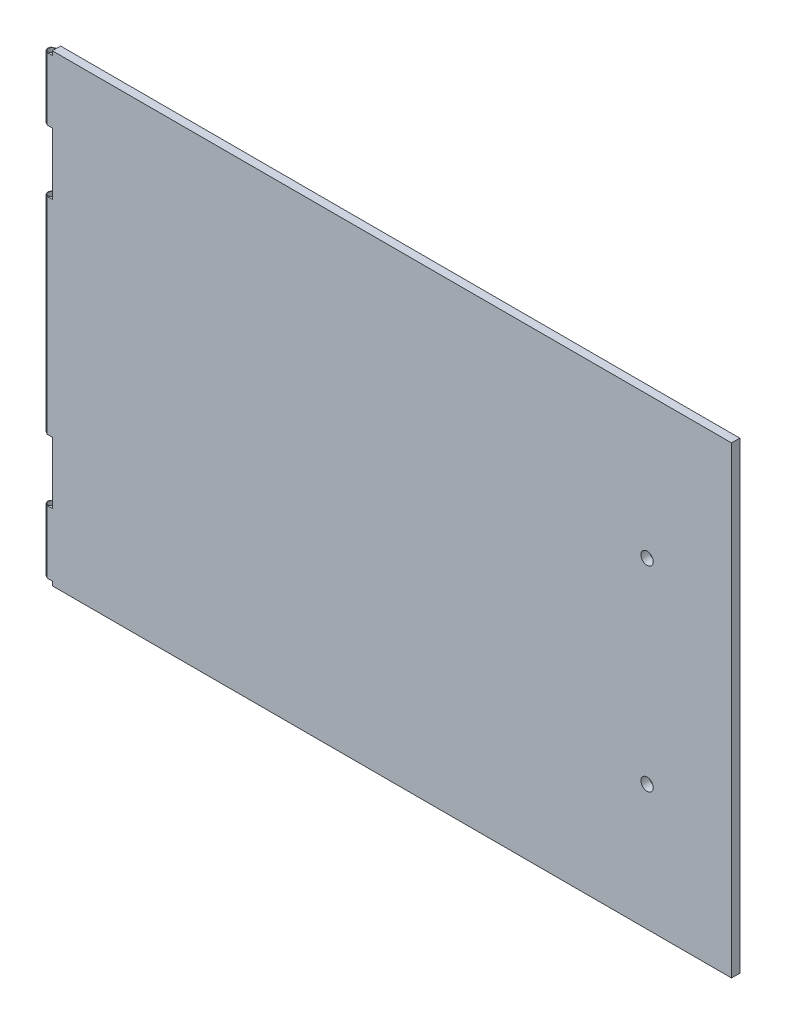
ISO-10303-21;
HEADER;
FILE_DESCRIPTION(('STEP AP214'),'2;1');
FILE_NAME('part.step','',(''),(''),'','','');
FILE_SCHEMA(('AUTOMOTIVE_DESIGN { 1 0 10303 214 1 1 1 1 }'));
ENDSEC;
DATA;
#1=APPLICATION_CONTEXT('core data for automotive mechanical design processes');
#2=APPLICATION_PROTOCOL_DEFINITION('international standard','automotive_design',2000,#1);
#3=PRODUCT_CONTEXT('',#1,'mechanical');
#4=PRODUCT('Part','Part','',(#3));
#5=PRODUCT_RELATED_PRODUCT_CATEGORY('part','',(#4));
#6=PRODUCT_DEFINITION_FORMATION('','',#4);
#7=PRODUCT_DEFINITION_CONTEXT('part definition',#1,'design');
#8=PRODUCT_DEFINITION('design','',#6,#7);
#9=PRODUCT_DEFINITION_SHAPE('','',#8);
#10=(LENGTH_UNIT() NAMED_UNIT(*) SI_UNIT(.MILLI.,.METRE.));
#11=(NAMED_UNIT(*) PLANE_ANGLE_UNIT() SI_UNIT($,.RADIAN.));
#12=(NAMED_UNIT(*) SI_UNIT($,.STERADIAN.) SOLID_ANGLE_UNIT());
#13=UNCERTAINTY_MEASURE_WITH_UNIT(LENGTH_MEASURE(1.E-05),#10,'distance_accuracy_value','');
#14=(GEOMETRIC_REPRESENTATION_CONTEXT(3) GLOBAL_UNCERTAINTY_ASSIGNED_CONTEXT((#13)) GLOBAL_UNIT_ASSIGNED_CONTEXT((#10,
#11,#12)) REPRESENTATION_CONTEXT('',''));
#15=CARTESIAN_POINT('',(0.,0.,0.));
#16=DIRECTION('',(0.,0.,1.));
#17=DIRECTION('',(1.,0.,0.));
#18=AXIS2_PLACEMENT_3D('',#15,#16,#17);
#19=CARTESIAN_POINT('',(1.75000000000003,1.11022302462516E-13,0.));
#20=DIRECTION('',(0.,1.,0.));
#21=DIRECTION('',(0.,0.,1.));
#22=AXIS2_PLACEMENT_3D('',#19,#20,#21);
#23=CYLINDRICAL_SURFACE('',#22,1.75);
#24=DIRECTION('',(0.,1.,0.));
#25=VECTOR('',#24,1.);
#26=CARTESIAN_POINT('',(1.75000000000003,1.11022302462516E-13,-1.74999999999992));
#27=LINE('',#26,#25);
#28=CARTESIAN_POINT('',(1.75000000000003,2.00000000000011,-1.74999999999992));
#29=VERTEX_POINT('',#28);
#30=CARTESIAN_POINT('',(1.75000000000003,32.5000000000001,-1.74999999999992));
#31=VERTEX_POINT('',#30);
#32=EDGE_CURVE('E373',#29,#31,#27,.T.);
#33=ORIENTED_EDGE('',*,*,#32,.F.);
#34=CARTESIAN_POINT('',(1.75000000000003,2.00000000000011,0.));
#35=DIRECTION('',(0.,1.,0.));
#36=DIRECTION('',(0.,0.,1.));
#37=AXIS2_PLACEMENT_3D('',#34,#35,#36);
#38=CIRCLE('',#37,1.75);
#39=CARTESIAN_POINT('',(1.75000000000003,2.00000000000011,1.74999999999992));
#40=VERTEX_POINT('',#39);
#41=EDGE_CURVE('E280',#40,#29,#38,.F.);
#42=ORIENTED_EDGE('',*,*,#41,.F.);
#43=DIRECTION('',(0.,1.,0.));
#44=VECTOR('',#43,1.);
#45=CARTESIAN_POINT('',(1.75000000000003,1.11022302462516E-13,1.74999999999992));
#46=LINE('',#45,#44);
#47=CARTESIAN_POINT('',(1.75000000000003,32.5000000000001,1.74999999999992));
#48=VERTEX_POINT('',#47);
#49=EDGE_CURVE('E361',#40,#48,#46,.T.);
#50=ORIENTED_EDGE('',*,*,#49,.T.);
#51=CARTESIAN_POINT('',(1.75000000000003,32.5000000000001,0.));
#52=DIRECTION('',(0.,-1.,0.));
#53=DIRECTION('',(1.,0.,0.));
#54=AXIS2_PLACEMENT_3D('',#51,#52,#53);
#55=CIRCLE('',#54,1.75);
#56=EDGE_CURVE('E354',#31,#48,#55,.F.);
#57=ORIENTED_EDGE('',*,*,#56,.F.);
#58=EDGE_LOOP('',(#33,#42,#50,#57));
#59=FACE_BOUND('',#58,.T.);
#60=ADVANCED_FACE('F73',(#59),#23,.T.);
#61=CARTESIAN_POINT('',(1.75000000000003,62.5000000000001,-1.74999999999992));
#62=VERTEX_POINT('',#61);
#63=CARTESIAN_POINT('',(1.74999999999959,162.5,-1.74999999999992));
#64=VERTEX_POINT('',#63);
#65=EDGE_CURVE('E375',#62,#64,#27,.T.);
#66=ORIENTED_EDGE('',*,*,#65,.F.);
#67=CARTESIAN_POINT('',(1.75000000000003,62.5000000000001,0.));
#68=DIRECTION('',(0.,1.,0.));
#69=DIRECTION('',(-1.,0.,0.));
#70=AXIS2_PLACEMENT_3D('',#67,#68,#69);
#71=CIRCLE('',#70,1.75);
#72=CARTESIAN_POINT('',(1.75000000000003,62.5000000000001,1.74999999999992));
#73=VERTEX_POINT('',#72);
#74=EDGE_CURVE('E345',#73,#62,#71,.F.);
#75=ORIENTED_EDGE('',*,*,#74,.F.);
#76=CARTESIAN_POINT('',(1.74999999999959,162.5,1.74999999999992));
#77=VERTEX_POINT('',#76);
#78=EDGE_CURVE('E364',#73,#77,#46,.T.);
#79=ORIENTED_EDGE('',*,*,#78,.T.);
#80=CARTESIAN_POINT('',(1.74999999999959,162.5,0.));
#81=DIRECTION('',(0.,-1.,0.));
#82=DIRECTION('',(0.,0.,-1.));
#83=AXIS2_PLACEMENT_3D('',#80,#81,#82);
#84=CIRCLE('',#83,1.75);
#85=EDGE_CURVE('E337',#64,#77,#84,.F.);
#86=ORIENTED_EDGE('',*,*,#85,.F.);
#87=EDGE_LOOP('',(#66,#75,#79,#86));
#88=FACE_BOUND('',#87,.T.);
#89=ADVANCED_FACE('F470',(#88),#23,.T.);
#90=CARTESIAN_POINT('',(1.75000000000014,1.11022302462516E-13,0.));
#91=DIRECTION('',(1.,0.,-1.05818132034585E-13));
#92=DIRECTION('',(-1.05818132034585E-13,0.,-1.));
#93=AXIS2_PLACEMENT_3D('',#90,#91,#92);
#94=PLANE('',#93);
#95=DIRECTION('',(0.,1.,0.));
#96=VECTOR('',#95,1.);
#97=CARTESIAN_POINT('',(1.75000000000003,1.11022302462516E-13,-1.99999999999978));
#98=LINE('',#97,#96);
#99=CARTESIAN_POINT('',(1.75000000000003,2.00000000000011,-1.99999999999978));
#100=VERTEX_POINT('',#99);
#101=CARTESIAN_POINT('',(1.74999999999992,32.5000000000001,-1.99999999999978));
#102=VERTEX_POINT('',#101);
#103=EDGE_CURVE('E369',#100,#102,#98,.T.);
#104=ORIENTED_EDGE('',*,*,#103,.F.);
#105=DIRECTION('',(1.05818132034585E-13,0.,1.));
#106=VECTOR('',#105,1.);
#107=CARTESIAN_POINT('',(1.75000000000014,2.00000000000011,0.));
#108=LINE('',#107,#106);
#109=EDGE_CURVE('E282',#100,#29,#108,.T.);
#110=ORIENTED_EDGE('',*,*,#109,.T.);
#111=ORIENTED_EDGE('',*,*,#32,.T.);
#112=DIRECTION('',(-1.05818132034585E-13,0.,-1.));
#113=VECTOR('',#112,1.);
#114=CARTESIAN_POINT('',(1.75000000000014,32.5000000000001,0.));
#115=LINE('',#114,#113);
#116=EDGE_CURVE('E357',#31,#102,#115,.T.);
#117=ORIENTED_EDGE('',*,*,#116,.T.);
#118=EDGE_LOOP('',(#104,#110,#111,#117));
#119=FACE_BOUND('',#118,.T.);
#120=ADVANCED_FACE('F453',(#119),#94,.F.);
#121=CARTESIAN_POINT('',(1.74999999999992,62.5000000000001,-1.99999999999978));
#122=VERTEX_POINT('',#121);
#123=CARTESIAN_POINT('',(1.74999999999947,162.5,-1.99999999999978));
#124=VERTEX_POINT('',#123);
#125=EDGE_CURVE('E372',#122,#124,#98,.T.);
#126=ORIENTED_EDGE('',*,*,#125,.F.);
#127=DIRECTION('',(1.05818132034585E-13,0.,1.));
#128=VECTOR('',#127,1.);
#129=CARTESIAN_POINT('',(1.75000000000014,62.5000000000001,0.));
#130=LINE('',#129,#128);
#131=EDGE_CURVE('E347',#122,#62,#130,.T.);
#132=ORIENTED_EDGE('',*,*,#131,.T.);
#133=ORIENTED_EDGE('',*,*,#65,.T.);
#134=DIRECTION('',(-1.05818132034585E-13,0.,-1.));
#135=VECTOR('',#134,1.);
#136=CARTESIAN_POINT('',(1.7499999999997,162.5,0.));
#137=LINE('',#136,#135);
#138=EDGE_CURVE('E339',#64,#124,#137,.T.);
#139=ORIENTED_EDGE('',*,*,#138,.T.);
#140=EDGE_LOOP('',(#126,#132,#133,#139));
#141=FACE_BOUND('',#140,.T.);
#142=ADVANCED_FACE('F468',(#141),#94,.F.);
#143=CARTESIAN_POINT('',(1.75000000000014,1.11022302462516E-13,0.));
#144=DIRECTION('',(-1.,0.,-1.05818132034585E-13));
#145=DIRECTION('',(-1.05818132034585E-13,0.,1.));
#146=AXIS2_PLACEMENT_3D('',#143,#144,#145);
#147=PLANE('',#146);
#148=DIRECTION('',(1.05818132034585E-13,0.,-1.));
#149=VECTOR('',#148,1.);
#150=CARTESIAN_POINT('',(1.75000000000014,2.00000000000011,0.));
#151=LINE('',#150,#149);
#152=CARTESIAN_POINT('',(1.75000000000003,2.00000000000011,1.99999999999978));
#153=VERTEX_POINT('',#152);
#154=EDGE_CURVE('E278',#153,#40,#151,.T.);
#155=ORIENTED_EDGE('',*,*,#154,.F.);
#156=DIRECTION('',(0.,1.,0.));
#157=VECTOR('',#156,1.);
#158=CARTESIAN_POINT('',(1.75000000000003,1.11022302462516E-13,1.99999999999978));
#159=LINE('',#158,#157);
#160=CARTESIAN_POINT('',(1.74999999999992,32.5000000000001,1.99999999999978));
#161=VERTEX_POINT('',#160);
#162=EDGE_CURVE('E366',#153,#161,#159,.T.);
#163=ORIENTED_EDGE('',*,*,#162,.T.);
#164=DIRECTION('',(-1.05818132034585E-13,0.,1.));
#165=VECTOR('',#164,1.);
#166=CARTESIAN_POINT('',(1.75000000000014,32.5000000000001,0.));
#167=LINE('',#166,#165);
#168=EDGE_CURVE('E351',#48,#161,#167,.T.);
#169=ORIENTED_EDGE('',*,*,#168,.F.);
#170=ORIENTED_EDGE('',*,*,#49,.F.);
#171=EDGE_LOOP('',(#155,#163,#169,#170));
#172=FACE_BOUND('',#171,.T.);
#173=ADVANCED_FACE('F442',(#172),#147,.T.);
#174=DIRECTION('',(1.05818132034585E-13,0.,-1.));
#175=VECTOR('',#174,1.);
#176=CARTESIAN_POINT('',(1.75000000000014,62.5000000000001,0.));
#177=LINE('',#176,#175);
#178=CARTESIAN_POINT('',(1.75000000000003,62.5000000000001,1.99999999999978));
#179=VERTEX_POINT('',#178);
#180=EDGE_CURVE('E343',#179,#73,#177,.T.);
#181=ORIENTED_EDGE('',*,*,#180,.F.);
#182=CARTESIAN_POINT('',(1.74999999999947,162.5,1.99999999999978));
#183=VERTEX_POINT('',#182);
#184=EDGE_CURVE('E368',#179,#183,#159,.T.);
#185=ORIENTED_EDGE('',*,*,#184,.T.);
#186=DIRECTION('',(-1.05818132034585E-13,0.,1.));
#187=VECTOR('',#186,1.);
#188=CARTESIAN_POINT('',(1.7499999999997,162.5,0.));
#189=LINE('',#188,#187);
#190=EDGE_CURVE('E335',#77,#183,#189,.T.);
#191=ORIENTED_EDGE('',*,*,#190,.F.);
#192=ORIENTED_EDGE('',*,*,#78,.F.);
#193=EDGE_LOOP('',(#181,#185,#191,#192));
#194=FACE_BOUND('',#193,.T.);
#195=ADVANCED_FACE('F488',(#194),#147,.T.);
#196=CARTESIAN_POINT('',(1.75000000000003,1.11022302462516E-13,0.));
#197=DIRECTION('',(0.,1.,0.));
#198=DIRECTION('',(0.,0.,1.));
#199=AXIS2_PLACEMENT_3D('',#196,#197,#198);
#200=CYLINDRICAL_SURFACE('',#199,1.5);
#201=CARTESIAN_POINT('',(1.75000000000003,2.00000000000011,0.));
#202=DIRECTION('',(0.,1.,0.));
#203=DIRECTION('',(0.,0.,1.));
#204=AXIS2_PLACEMENT_3D('',#201,#202,#203);
#205=CIRCLE('',#204,1.5);
#206=CARTESIAN_POINT('',(1.75000000000003,2.00000000000011,1.5));
#207=VERTEX_POINT('',#206);
#208=EDGE_CURVE('E275',#207,#207,#205,.F.);
#209=ORIENTED_EDGE('',*,*,#208,.T.);
#210=EDGE_LOOP('',(#209));
#211=FACE_BOUND('',#210,.T.);
#212=CARTESIAN_POINT('',(1.75000000000003,32.5000000000001,0.));
#213=DIRECTION('',(0.,-1.,0.));
#214=DIRECTION('',(1.,0.,0.));
#215=AXIS2_PLACEMENT_3D('',#212,#213,#214);
#216=CIRCLE('',#215,1.5);
#217=CARTESIAN_POINT('',(3.25000000000003,32.5000000000001,0.));
#218=VERTEX_POINT('',#217);
#219=EDGE_CURVE('E350',#218,#218,#216,.F.);
#220=ORIENTED_EDGE('',*,*,#219,.T.);
#221=EDGE_LOOP('',(#220));
#222=FACE_BOUND('',#221,.T.);
#223=ADVANCED_FACE('F515',(#211,#222),#200,.F.);
#224=CARTESIAN_POINT('',(0.,0.,1.99999999999978));
#225=DIRECTION('',(0.,1.,0.));
#226=DIRECTION('',(0.,0.,1.));
#227=AXIS2_PLACEMENT_3D('',#224,#225,#226);
#228=PLANE('',#227);
#229=DIRECTION('',(1.,0.,0.));
#230=VECTOR('',#229,1.);
#231=CARTESIAN_POINT('',(0.,0.,1.99999999999978));
#232=LINE('',#231,#230);
#233=CARTESIAN_POINT('',(4.24999999999998,-1.11022302462516E-13,1.99999999999978));
#234=VERTEX_POINT('',#233);
#235=CARTESIAN_POINT('',(333.999999999999,0.,1.99999999999978));
#236=VERTEX_POINT('',#235);
#237=EDGE_CURVE('E376',#234,#236,#232,.T.);
#238=ORIENTED_EDGE('',*,*,#237,.F.);
#239=DIRECTION('',(0.,0.,1.));
#240=VECTOR('',#239,1.);
#241=CARTESIAN_POINT('',(4.24999999999998,-1.11022302462516E-13,-1.99999999999978));
#242=LINE('',#241,#240);
#243=CARTESIAN_POINT('',(4.24999999999998,-1.11022302462516E-13,-1.99999999999978));
#244=VERTEX_POINT('',#243);
#245=EDGE_CURVE('E258',#244,#234,#242,.T.);
#246=ORIENTED_EDGE('',*,*,#245,.F.);
#247=DIRECTION('',(1.,0.,0.));
#248=VECTOR('',#247,1.);
#249=CARTESIAN_POINT('',(0.,0.,-1.99999999999978));
#250=LINE('',#249,#248);
#251=CARTESIAN_POINT('',(333.999999999999,0.,-1.99999999999978));
#252=VERTEX_POINT('',#251);
#253=EDGE_CURVE('E371',#244,#252,#250,.T.);
#254=ORIENTED_EDGE('',*,*,#253,.T.);
#255=DIRECTION('',(0.,0.,-1.));
#256=VECTOR('',#255,1.);
#257=CARTESIAN_POINT('',(333.999999999999,0.,1.99999999999978));
#258=LINE('',#257,#256);
#259=EDGE_CURVE('E12',#236,#252,#258,.T.);
#260=ORIENTED_EDGE('',*,*,#259,.F.);
#261=EDGE_LOOP('',(#238,#246,#254,#260));
#262=FACE_BOUND('',#261,.T.);
#263=ADVANCED_FACE('F75',(#262),#228,.F.);
#264=CARTESIAN_POINT('',(0.,225.,1.99999999999978));
#265=DIRECTION('',(0.,-1.,0.));
#266=DIRECTION('',(0.,0.,-1.));
#267=AXIS2_PLACEMENT_3D('',#264,#265,#266);
#268=PLANE('',#267);
#269=DIRECTION('',(-1.,0.,0.));
#270=VECTOR('',#269,1.);
#271=CARTESIAN_POINT('',(0.,225.,-1.99999999999978));
#272=LINE('',#271,#270);
#273=CARTESIAN_POINT('',(333.999999999999,225.,-1.99999999999978));
#274=VERTEX_POINT('',#273);
#275=CARTESIAN_POINT('',(4.24999999999998,225.,-1.99999999999978));
#276=VERTEX_POINT('',#275);
#277=EDGE_CURVE('E379',#274,#276,#272,.T.);
#278=ORIENTED_EDGE('',*,*,#277,.T.);
#279=DIRECTION('',(0.,0.,1.));
#280=VECTOR('',#279,1.);
#281=CARTESIAN_POINT('',(4.24999999999998,225.,-1.99999999999978));
#282=LINE('',#281,#280);
#283=CARTESIAN_POINT('',(4.24999999999998,225.,1.99999999999978));
#284=VERTEX_POINT('',#283);
#285=EDGE_CURVE('E232',#276,#284,#282,.T.);
#286=ORIENTED_EDGE('',*,*,#285,.T.);
#287=DIRECTION('',(-1.,0.,0.));
#288=VECTOR('',#287,1.);
#289=CARTESIAN_POINT('',(0.,225.,1.99999999999978));
#290=LINE('',#289,#288);
#291=CARTESIAN_POINT('',(333.999999999999,225.,1.99999999999978));
#292=VERTEX_POINT('',#291);
#293=EDGE_CURVE('E381',#292,#284,#290,.T.);
#294=ORIENTED_EDGE('',*,*,#293,.F.);
#295=DIRECTION('',(0.,0.,-1.));
#296=VECTOR('',#295,1.);
#297=CARTESIAN_POINT('',(333.999999999999,225.,1.99999999999978));
#298=LINE('',#297,#296);
#299=EDGE_CURVE('E82',#292,#274,#298,.T.);
#300=ORIENTED_EDGE('',*,*,#299,.T.);
#301=EDGE_LOOP('',(#278,#286,#294,#300));
#302=FACE_BOUND('',#301,.T.);
#303=ADVANCED_FACE('F417',(#302),#268,.F.);
#304=CARTESIAN_POINT('',(0.,0.,1.99999999999978));
#305=DIRECTION('',(0.,0.,-1.));
#306=DIRECTION('',(-1.,0.,0.));
#307=AXIS2_PLACEMENT_3D('',#304,#305,#306);
#308=PLANE('',#307);
#309=CARTESIAN_POINT('',(292.999999999999,155.999999999495,1.99999999999978));
#310=DIRECTION('',(0.,0.,1.));
#311=DIRECTION('',(1.,0.,0.));
#312=AXIS2_PLACEMENT_3D('',#309,#310,#311);
#313=CIRCLE('',#312,2.99999999999999);
#314=CARTESIAN_POINT('',(295.999999999999,155.999999999495,1.99999999999978));
#315=VERTEX_POINT('',#314);
#316=EDGE_CURVE('E401',#315,#315,#313,.T.);
#317=ORIENTED_EDGE('',*,*,#316,.F.);
#318=EDGE_LOOP('',(#317));
#319=FACE_BOUND('',#318,.T.);
#320=CARTESIAN_POINT('',(292.999999999999,60.9999999994946,1.99999999999978));
#321=DIRECTION('',(0.,0.,1.));
#322=DIRECTION('',(1.,0.,0.));
#323=AXIS2_PLACEMENT_3D('',#320,#321,#322);
#324=CIRCLE('',#323,2.99999999999999);
#325=CARTESIAN_POINT('',(295.999999999999,60.9999999994946,1.99999999999978));
#326=VERTEX_POINT('',#325);
#327=EDGE_CURVE('E251',#326,#326,#324,.T.);
#328=ORIENTED_EDGE('',*,*,#327,.F.);
#329=EDGE_LOOP('',(#328));
#330=FACE_BOUND('',#329,.T.);
#331=ORIENTED_EDGE('',*,*,#293,.T.);
#332=DIRECTION('',(0.,1.,0.));
#333=VECTOR('',#332,1.);
#334=CARTESIAN_POINT('',(4.24999999999998,225.,1.99999999999978));
#335=LINE('',#334,#333);
#336=CARTESIAN_POINT('',(4.24999999999998,223.,1.99999999999978));
#337=VERTEX_POINT('',#336);
#338=EDGE_CURVE('E247',#337,#284,#335,.T.);
#339=ORIENTED_EDGE('',*,*,#338,.F.);
#340=DIRECTION('',(1.,0.,0.));
#341=VECTOR('',#340,1.);
#342=CARTESIAN_POINT('',(0.,223.,1.99999999999978));
#343=LINE('',#342,#341);
#344=CARTESIAN_POINT('',(1.74999999999992,223.,1.99999999999978));
#345=VERTEX_POINT('',#344);
#346=EDGE_CURVE('E229',#345,#337,#343,.T.);
#347=ORIENTED_EDGE('',*,*,#346,.F.);
#348=CARTESIAN_POINT('',(1.75000000000003,192.5,1.99999999999978));
#349=VERTEX_POINT('',#348);
#350=EDGE_CURVE('E360',#349,#345,#159,.T.);
#351=ORIENTED_EDGE('',*,*,#350,.F.);
#352=DIRECTION('',(-1.,0.,0.));
#353=VECTOR('',#352,1.);
#354=CARTESIAN_POINT('',(4.24999999999998,192.5,1.99999999999978));
#355=LINE('',#354,#353);
#356=CARTESIAN_POINT('',(4.24999999999998,192.5,1.99999999999978));
#357=VERTEX_POINT('',#356);
#358=EDGE_CURVE('E316',#357,#349,#355,.T.);
#359=ORIENTED_EDGE('',*,*,#358,.F.);
#360=DIRECTION('',(0.,1.,0.));
#361=VECTOR('',#360,1.);
#362=CARTESIAN_POINT('',(4.24999999999998,192.5,1.99999999999978));
#363=LINE('',#362,#361);
#364=CARTESIAN_POINT('',(4.24999999999953,162.5,1.99999999999978));
#365=VERTEX_POINT('',#364);
#366=EDGE_CURVE('E300',#365,#357,#363,.T.);
#367=ORIENTED_EDGE('',*,*,#366,.F.);
#368=DIRECTION('',(1.,0.,0.));
#369=VECTOR('',#368,1.);
#370=CARTESIAN_POINT('',(4.24999999999953,162.5,1.99999999999978));
#371=LINE('',#370,#369);
#372=EDGE_CURVE('E314',#183,#365,#371,.T.);
#373=ORIENTED_EDGE('',*,*,#372,.F.);
#374=ORIENTED_EDGE('',*,*,#184,.F.);
#375=DIRECTION('',(-1.,0.,0.));
#376=VECTOR('',#375,1.);
#377=CARTESIAN_POINT('',(4.24999999999998,62.5,1.99999999999978));
#378=LINE('',#377,#376);
#379=CARTESIAN_POINT('',(4.24999999999998,62.5,1.99999999999978));
#380=VERTEX_POINT('',#379);
#381=EDGE_CURVE('E290',#380,#179,#378,.T.);
#382=ORIENTED_EDGE('',*,*,#381,.F.);
#383=DIRECTION('',(0.,1.,0.));
#384=VECTOR('',#383,1.);
#385=CARTESIAN_POINT('',(4.24999999999998,32.5,1.99999999999978));
#386=LINE('',#385,#384);
#387=CARTESIAN_POINT('',(4.24999999999998,32.5,1.99999999999978));
#388=VERTEX_POINT('',#387);
#389=EDGE_CURVE('E299',#388,#380,#386,.T.);
#390=ORIENTED_EDGE('',*,*,#389,.F.);
#391=DIRECTION('',(1.,0.,0.));
#392=VECTOR('',#391,1.);
#393=CARTESIAN_POINT('',(4.24999999999998,32.5,1.99999999999978));
#394=LINE('',#393,#392);
#395=EDGE_CURVE('E297',#161,#388,#394,.T.);
#396=ORIENTED_EDGE('',*,*,#395,.F.);
#397=ORIENTED_EDGE('',*,*,#162,.F.);
#398=DIRECTION('',(-1.,0.,0.));
#399=VECTOR('',#398,1.);
#400=CARTESIAN_POINT('',(0.,2.,1.99999999999978));
#401=LINE('',#400,#399);
#402=CARTESIAN_POINT('',(4.24999999999998,1.99999999999989,1.99999999999978));
#403=VERTEX_POINT('',#402);
#404=EDGE_CURVE('E262',#403,#153,#401,.T.);
#405=ORIENTED_EDGE('',*,*,#404,.F.);
#406=DIRECTION('',(0.,1.,0.));
#407=VECTOR('',#406,1.);
#408=CARTESIAN_POINT('',(4.24999999999998,-1.11022302462516E-13,1.99999999999978));
#409=LINE('',#408,#407);
#410=EDGE_CURVE('E254',#234,#403,#409,.T.);
#411=ORIENTED_EDGE('',*,*,#410,.F.);
#412=ORIENTED_EDGE('',*,*,#237,.T.);
#413=DIRECTION('',(0.,1.,0.));
#414=VECTOR('',#413,1.);
#415=CARTESIAN_POINT('',(333.999999999999,0.,1.99999999999978));
#416=LINE('',#415,#414);
#417=EDGE_CURVE('E378',#236,#292,#416,.T.);
#418=ORIENTED_EDGE('',*,*,#417,.T.);
#419=EDGE_LOOP('',(#331,#339,#347,#351,#359,#367,#373,#374,#382,#390,#396,#397,#405,#411,#412,#418));
#420=FACE_BOUND('',#419,.T.);
#421=ADVANCED_FACE('F413',(#319,#330,#420),#308,.F.);
#422=CARTESIAN_POINT('',(333.999999999999,0.,1.99999999999978));
#423=DIRECTION('',(-1.,0.,0.));
#424=DIRECTION('',(0.,0.,1.));
#425=AXIS2_PLACEMENT_3D('',#422,#423,#424);
#426=PLANE('',#425);
#427=DIRECTION('',(0.,1.,0.));
#428=VECTOR('',#427,1.);
#429=CARTESIAN_POINT('',(333.999999999999,0.,-1.99999999999978));
#430=LINE('',#429,#428);
#431=EDGE_CURVE('E385',#252,#274,#430,.T.);
#432=ORIENTED_EDGE('',*,*,#431,.T.);
#433=ORIENTED_EDGE('',*,*,#299,.F.);
#434=ORIENTED_EDGE('',*,*,#417,.F.);
#435=ORIENTED_EDGE('',*,*,#259,.T.);
#436=EDGE_LOOP('',(#432,#433,#434,#435));
#437=FACE_BOUND('',#436,.T.);
#438=ADVANCED_FACE('F416',(#437),#426,.F.);
#439=CARTESIAN_POINT('',(0.,0.,-1.99999999999978));
#440=DIRECTION('',(0.,0.,-1.));
#441=DIRECTION('',(-1.,0.,0.));
#442=AXIS2_PLACEMENT_3D('',#439,#440,#441);
#443=PLANE('',#442);
#444=CARTESIAN_POINT('',(292.999999999999,155.999999999495,-1.99999999999978));
#445=DIRECTION('',(0.,0.,-1.));
#446=DIRECTION('',(-1.,0.,0.));
#447=AXIS2_PLACEMENT_3D('',#444,#445,#446);
#448=CIRCLE('',#447,2.99999999999999);
#449=CARTESIAN_POINT('',(289.999999999999,155.999999999495,-1.99999999999978));
#450=VERTEX_POINT('',#449);
#451=EDGE_CURVE('E77',#450,#450,#448,.T.);
#452=ORIENTED_EDGE('',*,*,#451,.F.);
#453=EDGE_LOOP('',(#452));
#454=FACE_BOUND('',#453,.T.);
#455=CARTESIAN_POINT('',(292.999999999999,60.9999999994946,-1.99999999999978));
#456=DIRECTION('',(0.,0.,-1.));
#457=DIRECTION('',(-1.,0.,0.));
#458=AXIS2_PLACEMENT_3D('',#455,#456,#457);
#459=CIRCLE('',#458,2.99999999999999);
#460=CARTESIAN_POINT('',(289.999999999999,60.9999999994946,-1.99999999999978));
#461=VERTEX_POINT('',#460);
#462=EDGE_CURVE('E399',#461,#461,#459,.T.);
#463=ORIENTED_EDGE('',*,*,#462,.F.);
#464=EDGE_LOOP('',(#463));
#465=FACE_BOUND('',#464,.T.);
#466=DIRECTION('',(0.,1.,0.));
#467=VECTOR('',#466,1.);
#468=CARTESIAN_POINT('',(4.24999999999998,225.,-1.99999999999978));
#469=LINE('',#468,#467);
#470=CARTESIAN_POINT('',(4.24999999999998,223.,-1.99999999999978));
#471=VERTEX_POINT('',#470);
#472=EDGE_CURVE('E233',#471,#276,#469,.T.);
#473=ORIENTED_EDGE('',*,*,#472,.T.);
#474=ORIENTED_EDGE('',*,*,#277,.F.);
#475=ORIENTED_EDGE('',*,*,#431,.F.);
#476=ORIENTED_EDGE('',*,*,#253,.F.);
#477=DIRECTION('',(0.,1.,0.));
#478=VECTOR('',#477,1.);
#479=CARTESIAN_POINT('',(4.24999999999998,-1.11022302462516E-13,-1.99999999999978));
#480=LINE('',#479,#478);
#481=CARTESIAN_POINT('',(4.24999999999998,1.99999999999989,-1.99999999999978));
#482=VERTEX_POINT('',#481);
#483=EDGE_CURVE('E264',#244,#482,#480,.T.);
#484=ORIENTED_EDGE('',*,*,#483,.T.);
#485=DIRECTION('',(-1.,0.,0.));
#486=VECTOR('',#485,1.);
#487=CARTESIAN_POINT('',(0.,2.,-1.99999999999978));
#488=LINE('',#487,#486);
#489=EDGE_CURVE('E90',#482,#100,#488,.T.);
#490=ORIENTED_EDGE('',*,*,#489,.T.);
#491=ORIENTED_EDGE('',*,*,#103,.T.);
#492=DIRECTION('',(1.,0.,0.));
#493=VECTOR('',#492,1.);
#494=CARTESIAN_POINT('',(4.24999999999998,32.5,-1.99999999999978));
#495=LINE('',#494,#493);
#496=CARTESIAN_POINT('',(4.24999999999998,32.5,-1.99999999999978));
#497=VERTEX_POINT('',#496);
#498=EDGE_CURVE('E286',#102,#497,#495,.T.);
#499=ORIENTED_EDGE('',*,*,#498,.T.);
#500=DIRECTION('',(0.,1.,0.));
#501=VECTOR('',#500,1.);
#502=CARTESIAN_POINT('',(4.24999999999998,32.5,-1.99999999999978));
#503=LINE('',#502,#501);
#504=CARTESIAN_POINT('',(4.24999999999998,62.5,-1.99999999999978));
#505=VERTEX_POINT('',#504);
#506=EDGE_CURVE('E289',#497,#505,#503,.T.);
#507=ORIENTED_EDGE('',*,*,#506,.T.);
#508=DIRECTION('',(-1.,0.,0.));
#509=VECTOR('',#508,1.);
#510=CARTESIAN_POINT('',(4.24999999999998,62.5,-1.99999999999978));
#511=LINE('',#510,#509);
#512=EDGE_CURVE('E293',#505,#122,#511,.T.);
#513=ORIENTED_EDGE('',*,*,#512,.T.);
#514=ORIENTED_EDGE('',*,*,#125,.T.);
#515=DIRECTION('',(1.,0.,0.));
#516=VECTOR('',#515,1.);
#517=CARTESIAN_POINT('',(4.24999999999953,162.5,-1.99999999999978));
#518=LINE('',#517,#516);
#519=CARTESIAN_POINT('',(4.24999999999953,162.5,-1.99999999999978));
#520=VERTEX_POINT('',#519);
#521=EDGE_CURVE('E311',#124,#520,#518,.T.);
#522=ORIENTED_EDGE('',*,*,#521,.T.);
#523=DIRECTION('',(0.,1.,0.));
#524=VECTOR('',#523,1.);
#525=CARTESIAN_POINT('',(4.24999999999998,192.5,-1.99999999999978));
#526=LINE('',#525,#524);
#527=CARTESIAN_POINT('',(4.24999999999998,192.5,-1.99999999999978));
#528=VERTEX_POINT('',#527);
#529=EDGE_CURVE('E317',#520,#528,#526,.T.);
#530=ORIENTED_EDGE('',*,*,#529,.T.);
#531=DIRECTION('',(-1.,0.,0.));
#532=VECTOR('',#531,1.);
#533=CARTESIAN_POINT('',(4.24999999999998,192.5,-1.99999999999978));
#534=LINE('',#533,#532);
#535=CARTESIAN_POINT('',(1.74999999999992,192.5,-1.99999999999978));
#536=VERTEX_POINT('',#535);
#537=EDGE_CURVE('E323',#528,#536,#534,.T.);
#538=ORIENTED_EDGE('',*,*,#537,.T.);
#539=CARTESIAN_POINT('',(1.74999999999992,223.,-1.99999999999978));
#540=VERTEX_POINT('',#539);
#541=EDGE_CURVE('E246',#536,#540,#98,.T.);
#542=ORIENTED_EDGE('',*,*,#541,.T.);
#543=DIRECTION('',(1.,0.,0.));
#544=VECTOR('',#543,1.);
#545=CARTESIAN_POINT('',(0.,223.,-1.99999999999978));
#546=LINE('',#545,#544);
#547=EDGE_CURVE('E226',#540,#471,#546,.T.);
#548=ORIENTED_EDGE('',*,*,#547,.T.);
#549=EDGE_LOOP('',(#473,#474,#475,#476,#484,#490,#491,#499,#507,#513,#514,#522,#530,#538,#542,#548));
#550=FACE_BOUND('',#549,.T.);
#551=ADVANCED_FACE('F243',(#454,#465,#550),#443,.T.);
#552=CARTESIAN_POINT('',(1.75000000000003,223.,0.));
#553=DIRECTION('',(0.,-1.,0.));
#554=DIRECTION('',(0.,0.,-1.));
#555=AXIS2_PLACEMENT_3D('',#552,#553,#554);
#556=CIRCLE('',#555,1.75);
#557=CARTESIAN_POINT('',(1.75000000000003,223.,-1.74999999999992));
#558=VERTEX_POINT('',#557);
#559=CARTESIAN_POINT('',(1.75000000000003,223.,1.74999999999992));
#560=VERTEX_POINT('',#559);
#561=EDGE_CURVE('E98',#558,#560,#556,.F.);
#562=ORIENTED_EDGE('',*,*,#561,.F.);
#563=CARTESIAN_POINT('',(1.75000000000003,192.5,-1.74999999999992));
#564=VERTEX_POINT('',#563);
#565=EDGE_CURVE('E363',#564,#558,#27,.T.);
#566=ORIENTED_EDGE('',*,*,#565,.F.);
#567=CARTESIAN_POINT('',(1.75000000000003,192.5,0.));
#568=DIRECTION('',(0.,1.,0.));
#569=DIRECTION('',(0.,0.,1.));
#570=AXIS2_PLACEMENT_3D('',#567,#568,#569);
#571=CIRCLE('',#570,1.75);
#572=CARTESIAN_POINT('',(1.75000000000003,192.5,1.74999999999992));
#573=VERTEX_POINT('',#572);
#574=EDGE_CURVE('E329',#573,#564,#571,.F.);
#575=ORIENTED_EDGE('',*,*,#574,.F.);
#576=EDGE_CURVE('E365',#573,#560,#46,.T.);
#577=ORIENTED_EDGE('',*,*,#576,.T.);
#578=EDGE_LOOP('',(#562,#566,#575,#577));
#579=FACE_BOUND('',#578,.T.);
#580=ADVANCED_FACE('F480',(#579),#23,.T.);
#581=ORIENTED_EDGE('',*,*,#565,.T.);
#582=DIRECTION('',(-1.05818132034585E-13,0.,-1.));
#583=VECTOR('',#582,1.);
#584=CARTESIAN_POINT('',(1.75000000000014,223.,0.));
#585=LINE('',#584,#583);
#586=EDGE_CURVE('E273',#558,#540,#585,.T.);
#587=ORIENTED_EDGE('',*,*,#586,.T.);
#588=ORIENTED_EDGE('',*,*,#541,.F.);
#589=DIRECTION('',(1.05818132034585E-13,0.,1.));
#590=VECTOR('',#589,1.);
#591=CARTESIAN_POINT('',(1.75000000000014,192.5,0.));
#592=LINE('',#591,#590);
#593=EDGE_CURVE('E331',#536,#564,#592,.T.);
#594=ORIENTED_EDGE('',*,*,#593,.T.);
#595=EDGE_LOOP('',(#581,#587,#588,#594));
#596=FACE_BOUND('',#595,.T.);
#597=ADVANCED_FACE('F477',(#596),#94,.F.);
#598=DIRECTION('',(-1.05818132034585E-13,0.,1.));
#599=VECTOR('',#598,1.);
#600=CARTESIAN_POINT('',(1.75000000000014,223.,0.));
#601=LINE('',#600,#599);
#602=EDGE_CURVE('E270',#560,#345,#601,.T.);
#603=ORIENTED_EDGE('',*,*,#602,.F.);
#604=ORIENTED_EDGE('',*,*,#576,.F.);
#605=DIRECTION('',(1.05818132034585E-13,0.,-1.));
#606=VECTOR('',#605,1.);
#607=CARTESIAN_POINT('',(1.75000000000014,192.5,0.));
#608=LINE('',#607,#606);
#609=EDGE_CURVE('E327',#349,#573,#608,.T.);
#610=ORIENTED_EDGE('',*,*,#609,.F.);
#611=ORIENTED_EDGE('',*,*,#350,.T.);
#612=EDGE_LOOP('',(#603,#604,#610,#611));
#613=FACE_BOUND('',#612,.T.);
#614=ADVANCED_FACE('F504',(#613),#147,.T.);
#615=CARTESIAN_POINT('',(1.75000000000003,223.,0.));
#616=DIRECTION('',(0.,-1.,0.));
#617=DIRECTION('',(0.,0.,-1.));
#618=AXIS2_PLACEMENT_3D('',#615,#616,#617);
#619=CIRCLE('',#618,1.5);
#620=CARTESIAN_POINT('',(1.75000000000003,223.,-1.5));
#621=VERTEX_POINT('',#620);
#622=EDGE_CURVE('E256',#621,#621,#619,.F.);
#623=ORIENTED_EDGE('',*,*,#622,.T.);
#624=EDGE_LOOP('',(#623));
#625=FACE_BOUND('',#624,.T.);
#626=CARTESIAN_POINT('',(1.75000000000003,192.5,0.));
#627=DIRECTION('',(0.,1.,0.));
#628=DIRECTION('',(0.,0.,1.));
#629=AXIS2_PLACEMENT_3D('',#626,#627,#628);
#630=CIRCLE('',#629,1.5);
#631=CARTESIAN_POINT('',(1.75000000000003,192.5,1.5));
#632=VERTEX_POINT('',#631);
#633=EDGE_CURVE('E306',#632,#632,#630,.F.);
#634=ORIENTED_EDGE('',*,*,#633,.T.);
#635=EDGE_LOOP('',(#634));
#636=FACE_BOUND('',#635,.T.);
#637=ADVANCED_FACE('F506',(#625,#636),#200,.F.);
#638=CARTESIAN_POINT('',(4.24999999999953,162.5,-1.99999999999978));
#639=DIRECTION('',(0.,-1.,0.));
#640=DIRECTION('',(0.,0.,-1.));
#641=AXIS2_PLACEMENT_3D('',#638,#639,#640);
#642=PLANE('',#641);
#643=CARTESIAN_POINT('',(1.74999999999959,162.5,0.));
#644=DIRECTION('',(0.,-1.,0.));
#645=DIRECTION('',(0.,0.,-1.));
#646=AXIS2_PLACEMENT_3D('',#643,#644,#645);
#647=CIRCLE('',#646,1.5);
#648=CARTESIAN_POINT('',(1.74999999999959,162.5,-1.5));
#649=VERTEX_POINT('',#648);
#650=EDGE_CURVE('E334',#649,#649,#647,.F.);
#651=ORIENTED_EDGE('',*,*,#650,.F.);
#652=EDGE_LOOP('',(#651));
#653=FACE_BOUND('',#652,.T.);
#654=ORIENTED_EDGE('',*,*,#138,.F.);
#655=ORIENTED_EDGE('',*,*,#85,.T.);
#656=ORIENTED_EDGE('',*,*,#190,.T.);
#657=ORIENTED_EDGE('',*,*,#372,.T.);
#658=DIRECTION('',(0.,0.,1.));
#659=VECTOR('',#658,1.);
#660=CARTESIAN_POINT('',(4.24999999999953,162.5,-1.99999999999978));
#661=LINE('',#660,#659);
#662=EDGE_CURVE('E285',#520,#365,#661,.T.);
#663=ORIENTED_EDGE('',*,*,#662,.F.);
#664=ORIENTED_EDGE('',*,*,#521,.F.);
#665=EDGE_LOOP('',(#654,#655,#656,#657,#663,#664));
#666=FACE_BOUND('',#665,.T.);
#667=ADVANCED_FACE('F493',(#653,#666),#642,.F.);
#668=CARTESIAN_POINT('',(4.24999999999998,192.5,-1.99999999999978));
#669=DIRECTION('',(0.,1.,0.));
#670=DIRECTION('',(0.,0.,1.));
#671=AXIS2_PLACEMENT_3D('',#668,#669,#670);
#672=PLANE('',#671);
#673=ORIENTED_EDGE('',*,*,#633,.F.);
#674=EDGE_LOOP('',(#673));
#675=FACE_BOUND('',#674,.T.);
#676=ORIENTED_EDGE('',*,*,#537,.F.);
#677=DIRECTION('',(0.,0.,1.));
#678=VECTOR('',#677,1.);
#679=CARTESIAN_POINT('',(4.24999999999998,192.5,-1.99999999999978));
#680=LINE('',#679,#678);
#681=EDGE_CURVE('E309',#528,#357,#680,.T.);
#682=ORIENTED_EDGE('',*,*,#681,.T.);
#683=ORIENTED_EDGE('',*,*,#358,.T.);
#684=ORIENTED_EDGE('',*,*,#609,.T.);
#685=ORIENTED_EDGE('',*,*,#574,.T.);
#686=ORIENTED_EDGE('',*,*,#593,.F.);
#687=EDGE_LOOP('',(#676,#682,#683,#684,#685,#686));
#688=FACE_BOUND('',#687,.T.);
#689=ADVANCED_FACE('F502',(#675,#688),#672,.F.);
#690=CARTESIAN_POINT('',(4.24999999999998,192.5,-1.99999999999978));
#691=DIRECTION('',(1.,0.,0.));
#692=DIRECTION('',(0.,1.,0.));
#693=AXIS2_PLACEMENT_3D('',#690,#691,#692);
#694=PLANE('',#693);
#695=ORIENTED_EDGE('',*,*,#366,.T.);
#696=ORIENTED_EDGE('',*,*,#681,.F.);
#697=ORIENTED_EDGE('',*,*,#529,.F.);
#698=ORIENTED_EDGE('',*,*,#662,.T.);
#699=EDGE_LOOP('',(#695,#696,#697,#698));
#700=FACE_BOUND('',#699,.T.);
#701=ADVANCED_FACE('F498',(#700),#694,.F.);
#702=CARTESIAN_POINT('',(1.75000000000003,62.5000000000001,0.));
#703=DIRECTION('',(0.,1.,0.));
#704=DIRECTION('',(-1.,0.,0.));
#705=AXIS2_PLACEMENT_3D('',#702,#703,#704);
#706=CIRCLE('',#705,1.5);
#707=CARTESIAN_POINT('',(0.250000000000029,62.5000000000001,0.));
#708=VERTEX_POINT('',#707);
#709=EDGE_CURVE('E342',#708,#708,#706,.F.);
#710=ORIENTED_EDGE('',*,*,#709,.T.);
#711=EDGE_LOOP('',(#710));
#712=FACE_BOUND('',#711,.T.);
#713=ORIENTED_EDGE('',*,*,#650,.T.);
#714=EDGE_LOOP('',(#713));
#715=FACE_BOUND('',#714,.T.);
#716=ADVANCED_FACE('F516',(#712,#715),#200,.F.);
#717=CARTESIAN_POINT('',(4.24999999999998,32.5,-1.99999999999978));
#718=DIRECTION('',(0.,-1.,0.));
#719=DIRECTION('',(1.,0.,0.));
#720=AXIS2_PLACEMENT_3D('',#717,#718,#719);
#721=PLANE('',#720);
#722=ORIENTED_EDGE('',*,*,#219,.F.);
#723=EDGE_LOOP('',(#722));
#724=FACE_BOUND('',#723,.T.);
#725=ORIENTED_EDGE('',*,*,#116,.F.);
#726=ORIENTED_EDGE('',*,*,#56,.T.);
#727=ORIENTED_EDGE('',*,*,#168,.T.);
#728=ORIENTED_EDGE('',*,*,#395,.T.);
#729=DIRECTION('',(0.,0.,1.));
#730=VECTOR('',#729,1.);
#731=CARTESIAN_POINT('',(4.24999999999998,32.5,-1.99999999999978));
#732=LINE('',#731,#730);
#733=EDGE_CURVE('E296',#497,#388,#732,.T.);
#734=ORIENTED_EDGE('',*,*,#733,.F.);
#735=ORIENTED_EDGE('',*,*,#498,.F.);
#736=EDGE_LOOP('',(#725,#726,#727,#728,#734,#735));
#737=FACE_BOUND('',#736,.T.);
#738=ADVANCED_FACE('F449',(#724,#737),#721,.F.);
#739=CARTESIAN_POINT('',(4.24999999999998,62.5,-1.99999999999978));
#740=DIRECTION('',(0.,1.,0.));
#741=DIRECTION('',(-1.,0.,0.));
#742=AXIS2_PLACEMENT_3D('',#739,#740,#741);
#743=PLANE('',#742);
#744=ORIENTED_EDGE('',*,*,#709,.F.);
#745=EDGE_LOOP('',(#744));
#746=FACE_BOUND('',#745,.T.);
#747=ORIENTED_EDGE('',*,*,#512,.F.);
#748=DIRECTION('',(0.,0.,1.));
#749=VECTOR('',#748,1.);
#750=CARTESIAN_POINT('',(4.24999999999998,62.5,-1.99999999999978));
#751=LINE('',#750,#749);
#752=EDGE_CURVE('E304',#505,#380,#751,.T.);
#753=ORIENTED_EDGE('',*,*,#752,.T.);
#754=ORIENTED_EDGE('',*,*,#381,.T.);
#755=ORIENTED_EDGE('',*,*,#180,.T.);
#756=ORIENTED_EDGE('',*,*,#74,.T.);
#757=ORIENTED_EDGE('',*,*,#131,.F.);
#758=EDGE_LOOP('',(#747,#753,#754,#755,#756,#757));
#759=FACE_BOUND('',#758,.T.);
#760=ADVANCED_FACE('F463',(#746,#759),#743,.F.);
#761=CARTESIAN_POINT('',(4.24999999999998,32.5,-1.99999999999978));
#762=DIRECTION('',(1.,0.,0.));
#763=DIRECTION('',(0.,1.,0.));
#764=AXIS2_PLACEMENT_3D('',#761,#762,#763);
#765=PLANE('',#764);
#766=ORIENTED_EDGE('',*,*,#389,.T.);
#767=ORIENTED_EDGE('',*,*,#752,.F.);
#768=ORIENTED_EDGE('',*,*,#506,.F.);
#769=ORIENTED_EDGE('',*,*,#733,.T.);
#770=EDGE_LOOP('',(#766,#767,#768,#769));
#771=FACE_BOUND('',#770,.T.);
#772=ADVANCED_FACE('F459',(#771),#765,.F.);
#773=CARTESIAN_POINT('',(0.,223.,-1.99999999999978));
#774=DIRECTION('',(0.,-1.,0.));
#775=DIRECTION('',(0.,0.,-1.));
#776=AXIS2_PLACEMENT_3D('',#773,#774,#775);
#777=PLANE('',#776);
#778=ORIENTED_EDGE('',*,*,#622,.F.);
#779=EDGE_LOOP('',(#778));
#780=FACE_BOUND('',#779,.T.);
#781=ORIENTED_EDGE('',*,*,#586,.F.);
#782=ORIENTED_EDGE('',*,*,#561,.T.);
#783=ORIENTED_EDGE('',*,*,#602,.T.);
#784=ORIENTED_EDGE('',*,*,#346,.T.);
#785=DIRECTION('',(0.,0.,1.));
#786=VECTOR('',#785,1.);
#787=CARTESIAN_POINT('',(4.24999999999998,223.,-1.99999999999978));
#788=LINE('',#787,#786);
#789=EDGE_CURVE('E222',#471,#337,#788,.T.);
#790=ORIENTED_EDGE('',*,*,#789,.F.);
#791=ORIENTED_EDGE('',*,*,#547,.F.);
#792=EDGE_LOOP('',(#781,#782,#783,#784,#790,#791));
#793=FACE_BOUND('',#792,.T.);
#794=ADVANCED_FACE('F224',(#780,#793),#777,.F.);
#795=CARTESIAN_POINT('',(4.24999999999998,225.,-1.99999999999978));
#796=DIRECTION('',(1.,0.,0.));
#797=DIRECTION('',(0.,1.,0.));
#798=AXIS2_PLACEMENT_3D('',#795,#796,#797);
#799=PLANE('',#798);
#800=ORIENTED_EDGE('',*,*,#338,.T.);
#801=ORIENTED_EDGE('',*,*,#285,.F.);
#802=ORIENTED_EDGE('',*,*,#472,.F.);
#803=ORIENTED_EDGE('',*,*,#789,.T.);
#804=EDGE_LOOP('',(#800,#801,#802,#803));
#805=FACE_BOUND('',#804,.T.);
#806=ADVANCED_FACE('F236',(#805),#799,.F.);
#807=CARTESIAN_POINT('',(0.,2.,-1.99999999999978));
#808=DIRECTION('',(0.,1.,0.));
#809=DIRECTION('',(0.,0.,1.));
#810=AXIS2_PLACEMENT_3D('',#807,#808,#809);
#811=PLANE('',#810);
#812=ORIENTED_EDGE('',*,*,#208,.F.);
#813=EDGE_LOOP('',(#812));
#814=FACE_BOUND('',#813,.T.);
#815=ORIENTED_EDGE('',*,*,#489,.F.);
#816=DIRECTION('',(0.,0.,1.));
#817=VECTOR('',#816,1.);
#818=CARTESIAN_POINT('',(4.24999999999998,1.99999999999989,-1.99999999999978));
#819=LINE('',#818,#817);
#820=EDGE_CURVE('E260',#482,#403,#819,.T.);
#821=ORIENTED_EDGE('',*,*,#820,.T.);
#822=ORIENTED_EDGE('',*,*,#404,.T.);
#823=ORIENTED_EDGE('',*,*,#154,.T.);
#824=ORIENTED_EDGE('',*,*,#41,.T.);
#825=ORIENTED_EDGE('',*,*,#109,.F.);
#826=EDGE_LOOP('',(#815,#821,#822,#823,#824,#825));
#827=FACE_BOUND('',#826,.T.);
#828=ADVANCED_FACE('F438',(#814,#827),#811,.F.);
#829=CARTESIAN_POINT('',(4.24999999999998,-1.11022302462516E-13,-1.99999999999978));
#830=DIRECTION('',(1.,0.,0.));
#831=DIRECTION('',(0.,1.,0.));
#832=AXIS2_PLACEMENT_3D('',#829,#830,#831);
#833=PLANE('',#832);
#834=ORIENTED_EDGE('',*,*,#410,.T.);
#835=ORIENTED_EDGE('',*,*,#820,.F.);
#836=ORIENTED_EDGE('',*,*,#483,.F.);
#837=ORIENTED_EDGE('',*,*,#245,.T.);
#838=EDGE_LOOP('',(#834,#835,#836,#837));
#839=FACE_BOUND('',#838,.T.);
#840=ADVANCED_FACE('F433',(#839),#833,.F.);
#841=CARTESIAN_POINT('',(292.999999999999,60.9999999994946,-8.00000000000001));
#842=DIRECTION('',(0.,0.,1.));
#843=DIRECTION('',(1.,0.,0.));
#844=AXIS2_PLACEMENT_3D('',#841,#842,#843);
#845=CYLINDRICAL_SURFACE('',#844,2.99999999999999);
#846=ORIENTED_EDGE('',*,*,#462,.T.);
#847=EDGE_LOOP('',(#846));
#848=FACE_BOUND('',#847,.T.);
#849=ORIENTED_EDGE('',*,*,#327,.T.);
#850=EDGE_LOOP('',(#849));
#851=FACE_BOUND('',#850,.T.);
#852=ADVANCED_FACE('F411',(#848,#851),#845,.F.);
#853=CARTESIAN_POINT('',(292.999999999999,155.999999999495,-8.00000000000001));
#854=DIRECTION('',(0.,0.,1.));
#855=DIRECTION('',(1.,0.,0.));
#856=AXIS2_PLACEMENT_3D('',#853,#854,#855);
#857=CYLINDRICAL_SURFACE('',#856,2.99999999999999);
#858=ORIENTED_EDGE('',*,*,#451,.T.);
#859=EDGE_LOOP('',(#858));
#860=FACE_BOUND('',#859,.T.);
#861=ORIENTED_EDGE('',*,*,#316,.T.);
#862=EDGE_LOOP('',(#861));
#863=FACE_BOUND('',#862,.T.);
#864=ADVANCED_FACE('F592',(#860,#863),#857,.F.);
#865=CLOSED_SHELL('',(#60,#89,#120,#142,#173,#195,#223,#263,#303,#421,#438,#551,#580,#597,#614,
#637,#667,#689,#701,#716,#738,#760,#772,#794,#806,#828,#840,#852,#864));
#866=MANIFOLD_SOLID_BREP('B2',#865);
#867=ADVANCED_BREP_SHAPE_REPRESENTATION('',(#18,#866),#14);
#868=SHAPE_DEFINITION_REPRESENTATION(#9,#867);
ENDSEC;
END-ISO-10303-21;
